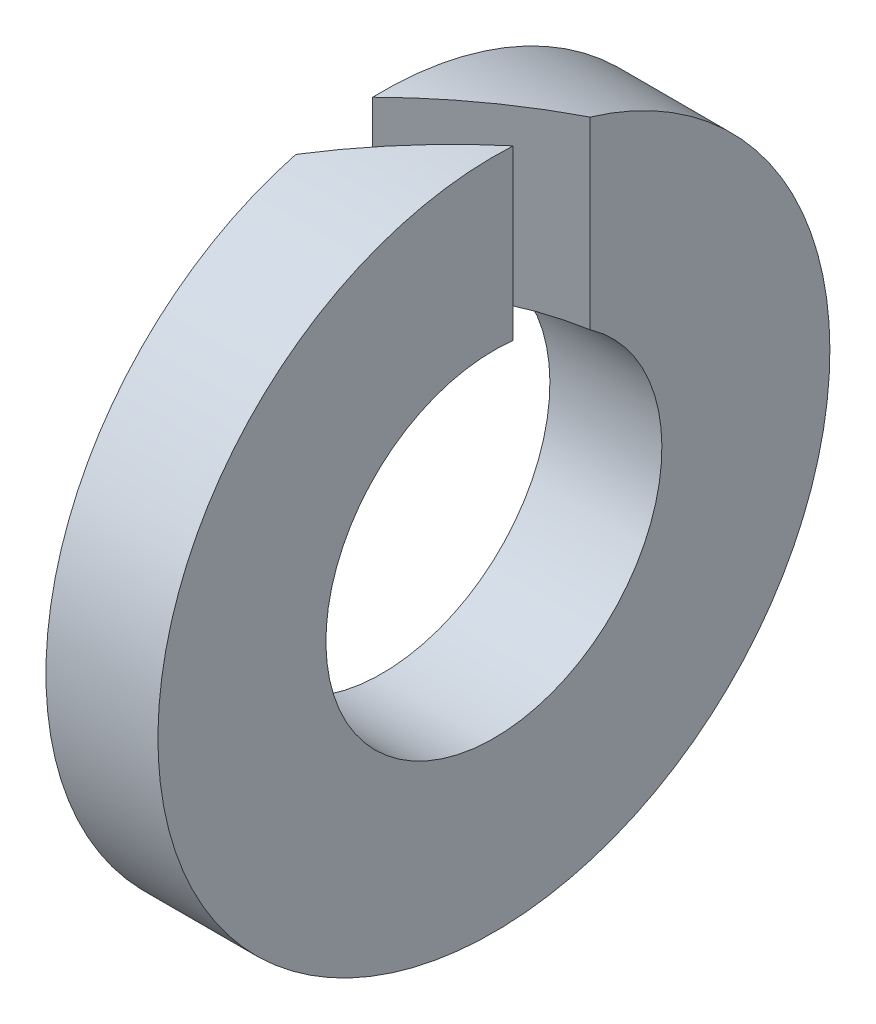
ISO-10303-21;
HEADER;
FILE_DESCRIPTION(('STEP AP214'),'2;1');
FILE_NAME('part.step','',(''),(''),'','','');
FILE_SCHEMA(('AUTOMOTIVE_DESIGN { 1 0 10303 214 1 1 1 1 }'));
ENDSEC;
DATA;
#1=APPLICATION_CONTEXT('core data for automotive mechanical design processes');
#2=APPLICATION_PROTOCOL_DEFINITION('international standard','automotive_design',2000,#1);
#3=PRODUCT_CONTEXT('',#1,'mechanical');
#4=PRODUCT('Part','Part','',(#3));
#5=PRODUCT_RELATED_PRODUCT_CATEGORY('part','',(#4));
#6=PRODUCT_DEFINITION_FORMATION('','',#4);
#7=PRODUCT_DEFINITION_CONTEXT('part definition',#1,'design');
#8=PRODUCT_DEFINITION('design','',#6,#7);
#9=PRODUCT_DEFINITION_SHAPE('','',#8);
#10=(LENGTH_UNIT() NAMED_UNIT(*) SI_UNIT(.MILLI.,.METRE.));
#11=(NAMED_UNIT(*) PLANE_ANGLE_UNIT() SI_UNIT($,.RADIAN.));
#12=(NAMED_UNIT(*) SI_UNIT($,.STERADIAN.) SOLID_ANGLE_UNIT());
#13=UNCERTAINTY_MEASURE_WITH_UNIT(LENGTH_MEASURE(1.E-05),#10,'distance_accuracy_value','');
#14=(GEOMETRIC_REPRESENTATION_CONTEXT(3) GLOBAL_UNCERTAINTY_ASSIGNED_CONTEXT((#13)) GLOBAL_UNIT_ASSIGNED_CONTEXT((#10,
#11,#12)) REPRESENTATION_CONTEXT('',''));
#15=CARTESIAN_POINT('',(0.,0.,0.));
#16=DIRECTION('',(0.,0.,1.));
#17=DIRECTION('',(1.,0.,0.));
#18=AXIS2_PLACEMENT_3D('',#15,#16,#17);
#19=CARTESIAN_POINT('',(0.,1.5,0.));
#20=DIRECTION('',(-1.,0.,0.));
#21=DIRECTION('',(0.,0.,1.));
#22=AXIS2_PLACEMENT_3D('',#19,#20,#21);
#23=PLANE('',#22);
#24=DIRECTION('',(0.,1.,0.));
#25=VECTOR('',#24,1.);
#26=CARTESIAN_POINT('',(0.,1.5,-0.858698844686492));
#27=LINE('',#26,#25);
#28=CARTESIAN_POINT('',(0.,1.22989279782186,-0.858698844686493));
#29=VERTEX_POINT('',#28);
#30=CARTESIAN_POINT('',(0.,2.87448017807291,-0.858698844686494));
#31=VERTEX_POINT('',#30);
#32=EDGE_CURVE('E78',#29,#31,#27,.T.);
#33=ORIENTED_EDGE('',*,*,#32,.F.);
#34=CARTESIAN_POINT('',(0.,0.,0.));
#35=DIRECTION('',(-1.,0.,0.));
#36=DIRECTION('',(0.,0.,1.));
#37=AXIS2_PLACEMENT_3D('',#34,#35,#36);
#38=CIRCLE('',#37,1.5);
#39=CARTESIAN_POINT('',(0.,1.49010260373605,-0.172029736787115));
#40=VERTEX_POINT('',#39);
#41=EDGE_CURVE('E54',#29,#40,#38,.T.);
#42=ORIENTED_EDGE('',*,*,#41,.T.);
#43=DIRECTION('',(0.,1.,0.));
#44=VECTOR('',#43,1.);
#45=CARTESIAN_POINT('',(0.,10.,-0.172029736787114));
#46=LINE('',#45,#44);
#47=CARTESIAN_POINT('',(0.,2.9950635668815,-0.172029736787115));
#48=VERTEX_POINT('',#47);
#49=EDGE_CURVE('E77',#48,#40,#46,.F.);
#50=ORIENTED_EDGE('',*,*,#49,.F.);
#51=CARTESIAN_POINT('',(0.,0.,0.));
#52=DIRECTION('',(-1.,0.,0.));
#53=DIRECTION('',(0.,0.,1.));
#54=AXIS2_PLACEMENT_3D('',#51,#52,#53);
#55=CIRCLE('',#54,3.);
#56=EDGE_CURVE('E87',#31,#48,#55,.T.);
#57=ORIENTED_EDGE('',*,*,#56,.F.);
#58=EDGE_LOOP('',(#33,#42,#50,#57));
#59=FACE_BOUND('',#58,.T.);
#60=ADVANCED_FACE('F17',(#59),#23,.F.);
#61=CARTESIAN_POINT('',(-34.9249999999999,0.,0.));
#62=DIRECTION('',(-1.,0.,0.));
#63=DIRECTION('',(0.,0.,1.));
#64=AXIS2_PLACEMENT_3D('',#61,#62,#63);
#65=CYLINDRICAL_SURFACE('',#64,1.5);
#66=ORIENTED_EDGE('',*,*,#41,.F.);
#67=CARTESIAN_POINT('',(-0.912241527663796,0.,0.));
#68=DIRECTION('',(0.685414889750449,0.,0.728152751082065));
#69=DIRECTION('',(-0.728152751082065,0.,0.685414889750449));
#70=AXIS2_PLACEMENT_3D('',#67,#68,#69);
#71=ELLIPSE('',#70,2.18845552151067,1.5);
#72=CARTESIAN_POINT('',(-1.,1.49772359986731,0.0826076170852902));
#73=VERTEX_POINT('',#72);
#74=EDGE_CURVE('E65',#73,#29,#71,.F.);
#75=ORIENTED_EDGE('',*,*,#74,.F.);
#76=CARTESIAN_POINT('',(-1.,0.,0.));
#77=DIRECTION('',(-1.,0.,0.));
#78=DIRECTION('',(0.,0.,1.));
#79=AXIS2_PLACEMENT_3D('',#76,#77,#78);
#80=CIRCLE('',#79,1.5);
#81=CARTESIAN_POINT('',(-1.,1.28771631984566,0.76927672498467));
#82=VERTEX_POINT('',#81);
#83=EDGE_CURVE('E59',#73,#82,#80,.T.);
#84=ORIENTED_EDGE('',*,*,#83,.T.);
#85=CARTESIAN_POINT('',(-0.182756353826904,0.,0.));
#86=DIRECTION('',(-0.685414889750449,0.,-0.728152751082065));
#87=DIRECTION('',(-0.728152751082065,0.,0.685414889750449));
#88=AXIS2_PLACEMENT_3D('',#85,#86,#87);
#89=ELLIPSE('',#88,2.18845552151067,1.5);
#90=EDGE_CURVE('E20',#40,#82,#89,.F.);
#91=ORIENTED_EDGE('',*,*,#90,.F.);
#92=EDGE_LOOP('',(#66,#75,#84,#91));
#93=FACE_BOUND('',#92,.T.);
#94=ADVANCED_FACE('F61',(#93),#65,.F.);
#95=CARTESIAN_POINT('',(-1.03202176016051,10.,0.799419014741065));
#96=DIRECTION('',(-0.685414889750449,0.,-0.728152751082065));
#97=DIRECTION('',(-0.728152751082065,0.,0.685414889750449));
#98=AXIS2_PLACEMENT_3D('',#95,#96,#97);
#99=PLANE('',#98);
#100=CARTESIAN_POINT('',(-0.182756353826904,0.,0.));
#101=DIRECTION('',(-0.685414889750449,0.,-0.728152751082065));
#102=DIRECTION('',(-0.728152751082065,0.,0.685414889750449));
#103=AXIS2_PLACEMENT_3D('',#100,#101,#102);
#104=ELLIPSE('',#103,4.37691104302135,3.);
#105=CARTESIAN_POINT('',(-1.,2.89969193542984,0.76927672498467));
#106=VERTEX_POINT('',#105);
#107=EDGE_CURVE('E89',#48,#106,#104,.F.);
#108=ORIENTED_EDGE('',*,*,#107,.F.);
#109=ORIENTED_EDGE('',*,*,#49,.T.);
#110=ORIENTED_EDGE('',*,*,#90,.T.);
#111=DIRECTION('',(0.,1.,0.));
#112=VECTOR('',#111,1.);
#113=CARTESIAN_POINT('',(-1.,3.,0.769276724984671));
#114=LINE('',#113,#112);
#115=EDGE_CURVE('E68',#82,#106,#114,.T.);
#116=ORIENTED_EDGE('',*,*,#115,.T.);
#117=EDGE_LOOP('',(#108,#109,#110,#116));
#118=FACE_BOUND('',#117,.T.);
#119=ADVANCED_FACE('F76',(#118),#99,.T.);
#120=CARTESIAN_POINT('',(-34.9249999999999,0.,0.));
#121=DIRECTION('',(-1.,0.,0.));
#122=DIRECTION('',(0.,0.,1.));
#123=AXIS2_PLACEMENT_3D('',#120,#121,#122);
#124=CYLINDRICAL_SURFACE('',#123,3.);
#125=CARTESIAN_POINT('',(-1.,0.,0.));
#126=DIRECTION('',(-1.,0.,0.));
#127=DIRECTION('',(0.,0.,1.));
#128=AXIS2_PLACEMENT_3D('',#125,#126,#127);
#129=CIRCLE('',#128,3.);
#130=CARTESIAN_POINT('',(-1.,2.99886244792913,0.0826076170852903));
#131=VERTEX_POINT('',#130);
#132=EDGE_CURVE('E26',#106,#131,#129,.F.);
#133=ORIENTED_EDGE('',*,*,#132,.T.);
#134=CARTESIAN_POINT('',(-0.912241527663796,0.,0.));
#135=DIRECTION('',(0.685414889750449,0.,0.728152751082065));
#136=DIRECTION('',(-0.728152751082065,0.,0.685414889750449));
#137=AXIS2_PLACEMENT_3D('',#134,#135,#136);
#138=ELLIPSE('',#137,4.37691104302135,3.);
#139=EDGE_CURVE('E69',#31,#131,#138,.T.);
#140=ORIENTED_EDGE('',*,*,#139,.F.);
#141=ORIENTED_EDGE('',*,*,#56,.T.);
#142=ORIENTED_EDGE('',*,*,#107,.T.);
#143=EDGE_LOOP('',(#133,#140,#141,#142));
#144=FACE_BOUND('',#143,.T.);
#145=ADVANCED_FACE('F90',(#144),#124,.T.);
#146=CARTESIAN_POINT('',(0.0904176956878326,10.,-0.943809605895964));
#147=DIRECTION('',(0.685414889750449,0.,0.728152751082065));
#148=DIRECTION('',(0.728152751082065,0.,-0.685414889750449));
#149=AXIS2_PLACEMENT_3D('',#146,#147,#148);
#150=PLANE('',#149);
#151=ORIENTED_EDGE('',*,*,#139,.T.);
#152=DIRECTION('',(0.,1.,0.));
#153=VECTOR('',#152,1.);
#154=CARTESIAN_POINT('',(-1.,3.,0.0826076170852902));
#155=LINE('',#154,#153);
#156=EDGE_CURVE('E11',#131,#73,#155,.F.);
#157=ORIENTED_EDGE('',*,*,#156,.T.);
#158=ORIENTED_EDGE('',*,*,#74,.T.);
#159=ORIENTED_EDGE('',*,*,#32,.T.);
#160=EDGE_LOOP('',(#151,#157,#158,#159));
#161=FACE_BOUND('',#160,.T.);
#162=ADVANCED_FACE('F97',(#161),#150,.T.);
#163=CARTESIAN_POINT('',(-1.,3.,0.));
#164=DIRECTION('',(1.,0.,0.));
#165=DIRECTION('',(0.,0.,-1.));
#166=AXIS2_PLACEMENT_3D('',#163,#164,#165);
#167=PLANE('',#166);
#168=ORIENTED_EDGE('',*,*,#156,.F.);
#169=ORIENTED_EDGE('',*,*,#132,.F.);
#170=ORIENTED_EDGE('',*,*,#115,.F.);
#171=ORIENTED_EDGE('',*,*,#83,.F.);
#172=EDGE_LOOP('',(#168,#169,#170,#171));
#173=FACE_BOUND('',#172,.T.);
#174=ADVANCED_FACE('F72',(#173),#167,.F.);
#175=CLOSED_SHELL('',(#60,#94,#119,#145,#162,#174));
#176=MANIFOLD_SOLID_BREP('B1',#175);
#177=ADVANCED_BREP_SHAPE_REPRESENTATION('',(#18,#176),#14);
#178=SHAPE_DEFINITION_REPRESENTATION(#9,#177);
ENDSEC;
END-ISO-10303-21;
